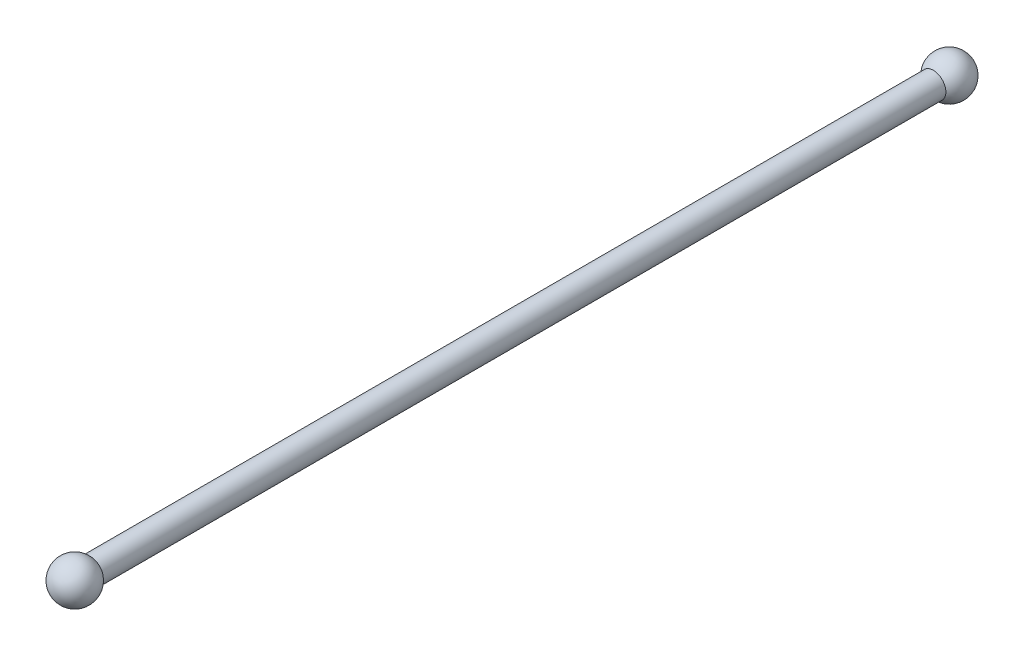
ISO-10303-21;
HEADER;
FILE_DESCRIPTION(('STEP AP214'),'2;1');
FILE_NAME('part.step','',(''),(''),'','','');
FILE_SCHEMA(('AUTOMOTIVE_DESIGN { 1 0 10303 214 1 1 1 1 }'));
ENDSEC;
DATA;
#1=APPLICATION_CONTEXT('core data for automotive mechanical design processes');
#2=APPLICATION_PROTOCOL_DEFINITION('international standard','automotive_design',2000,#1);
#3=PRODUCT_CONTEXT('',#1,'mechanical');
#4=PRODUCT('Part','Part','',(#3));
#5=PRODUCT_RELATED_PRODUCT_CATEGORY('part','',(#4));
#6=PRODUCT_DEFINITION_FORMATION('','',#4);
#7=PRODUCT_DEFINITION_CONTEXT('part definition',#1,'design');
#8=PRODUCT_DEFINITION('design','',#6,#7);
#9=PRODUCT_DEFINITION_SHAPE('','',#8);
#10=(LENGTH_UNIT() NAMED_UNIT(*) SI_UNIT(.MILLI.,.METRE.));
#11=(NAMED_UNIT(*) PLANE_ANGLE_UNIT() SI_UNIT($,.RADIAN.));
#12=(NAMED_UNIT(*) SI_UNIT($,.STERADIAN.) SOLID_ANGLE_UNIT());
#13=UNCERTAINTY_MEASURE_WITH_UNIT(LENGTH_MEASURE(1.E-05),#10,'distance_accuracy_value','');
#14=(GEOMETRIC_REPRESENTATION_CONTEXT(3) GLOBAL_UNCERTAINTY_ASSIGNED_CONTEXT((#13)) GLOBAL_UNIT_ASSIGNED_CONTEXT((#10,
#11,#12)) REPRESENTATION_CONTEXT('',''));
#15=CARTESIAN_POINT('',(0.,0.,0.));
#16=DIRECTION('',(0.,0.,1.));
#17=DIRECTION('',(1.,0.,0.));
#18=AXIS2_PLACEMENT_3D('',#15,#16,#17);
#19=CARTESIAN_POINT('',(0.,0.,116.));
#20=DIRECTION('',(0.,0.,-1.));
#21=DIRECTION('',(-1.,0.,0.));
#22=AXIS2_PLACEMENT_3D('',#19,#20,#21);
#23=CYLINDRICAL_SURFACE('',#22,1.73);
#24=CARTESIAN_POINT('',(0.,0.,116.));
#25=DIRECTION('',(0.,0.,1.));
#26=DIRECTION('',(1.,0.,0.));
#27=AXIS2_PLACEMENT_3D('',#24,#25,#26);
#28=CIRCLE('',#27,1.73);
#29=CARTESIAN_POINT('',(-1.73,0.,116.));
#30=VERTEX_POINT('',#29);
#31=EDGE_CURVE('E10',#30,#30,#28,.T.);
#32=CARTESIAN_POINT('',(0.,0.,0.));
#33=DIRECTION('',(0.,0.,1.));
#34=DIRECTION('',(1.,0.,0.));
#35=AXIS2_PLACEMENT_3D('',#32,#33,#34);
#36=CIRCLE('',#35,1.73);
#37=CARTESIAN_POINT('',(-1.73,0.,0.));
#38=VERTEX_POINT('',#37);
#39=EDGE_CURVE('E38',#38,#38,#36,.T.);
#40=CARTESIAN_POINT('',(-1.73,0.,116.));
#41=CARTESIAN_POINT('',(-1.73,0.,114.791666666667));
#42=CARTESIAN_POINT('',(-1.73,0.,113.583333333333));
#43=CARTESIAN_POINT('',(-1.73,0.,111.166666666667));
#44=CARTESIAN_POINT('',(-1.73,0.,109.958333333333));
#45=CARTESIAN_POINT('',(-1.73,0.,107.541666666667));
#46=CARTESIAN_POINT('',(-1.73,0.,106.333333333333));
#47=CARTESIAN_POINT('',(-1.73,0.,103.916666666667));
#48=CARTESIAN_POINT('',(-1.73,0.,102.708333333333));
#49=CARTESIAN_POINT('',(-1.73,0.,100.291666666667));
#50=CARTESIAN_POINT('',(-1.73,0.,99.0833333333333));
#51=CARTESIAN_POINT('',(-1.73,0.,96.6666666666667));
#52=CARTESIAN_POINT('',(-1.73,0.,95.4583333333333));
#53=CARTESIAN_POINT('',(-1.73,0.,93.0416666666667));
#54=CARTESIAN_POINT('',(-1.73,0.,91.8333333333333));
#55=CARTESIAN_POINT('',(-1.73,0.,89.4166666666667));
#56=CARTESIAN_POINT('',(-1.73,0.,88.2083333333333));
#57=CARTESIAN_POINT('',(-1.73,0.,85.7916666666667));
#58=CARTESIAN_POINT('',(-1.73,0.,84.5833333333333));
#59=CARTESIAN_POINT('',(-1.73,0.,82.1666666666667));
#60=CARTESIAN_POINT('',(-1.73,0.,80.9583333333333));
#61=CARTESIAN_POINT('',(-1.73,0.,78.5416666666667));
#62=CARTESIAN_POINT('',(-1.73,0.,77.3333333333333));
#63=CARTESIAN_POINT('',(-1.73,0.,74.9166666666667));
#64=CARTESIAN_POINT('',(-1.73,0.,73.7083333333333));
#65=CARTESIAN_POINT('',(-1.73,0.,71.2916666666667));
#66=CARTESIAN_POINT('',(-1.73,0.,70.0833333333333));
#67=CARTESIAN_POINT('',(-1.73,0.,67.6666666666667));
#68=CARTESIAN_POINT('',(-1.73,0.,66.4583333333333));
#69=CARTESIAN_POINT('',(-1.73,0.,64.0416666666667));
#70=CARTESIAN_POINT('',(-1.73,0.,62.8333333333333));
#71=CARTESIAN_POINT('',(-1.73,0.,60.4166666666667));
#72=CARTESIAN_POINT('',(-1.73,0.,59.2083333333333));
#73=CARTESIAN_POINT('',(-1.73,0.,56.7916666666667));
#74=CARTESIAN_POINT('',(-1.73,0.,55.5833333333333));
#75=CARTESIAN_POINT('',(-1.73,0.,53.1666666666667));
#76=CARTESIAN_POINT('',(-1.73,0.,51.9583333333333));
#77=CARTESIAN_POINT('',(-1.73,0.,49.5416666666667));
#78=CARTESIAN_POINT('',(-1.73,0.,48.3333333333333));
#79=CARTESIAN_POINT('',(-1.73,0.,45.9166666666667));
#80=CARTESIAN_POINT('',(-1.73,0.,44.7083333333333));
#81=CARTESIAN_POINT('',(-1.73,0.,42.2916666666667));
#82=CARTESIAN_POINT('',(-1.73,0.,41.0833333333333));
#83=CARTESIAN_POINT('',(-1.73,0.,38.6666666666667));
#84=CARTESIAN_POINT('',(-1.73,0.,37.4583333333333));
#85=CARTESIAN_POINT('',(-1.73,0.,35.0416666666667));
#86=CARTESIAN_POINT('',(-1.73,0.,33.8333333333333));
#87=CARTESIAN_POINT('',(-1.73,0.,31.4166666666667));
#88=CARTESIAN_POINT('',(-1.73,0.,30.2083333333333));
#89=CARTESIAN_POINT('',(-1.73,0.,27.7916666666667));
#90=CARTESIAN_POINT('',(-1.73,0.,26.5833333333333));
#91=CARTESIAN_POINT('',(-1.73,0.,24.1666666666667));
#92=CARTESIAN_POINT('',(-1.73,0.,22.9583333333333));
#93=CARTESIAN_POINT('',(-1.73,0.,20.5416666666667));
#94=CARTESIAN_POINT('',(-1.73,0.,19.3333333333333));
#95=CARTESIAN_POINT('',(-1.73,0.,16.9166666666667));
#96=CARTESIAN_POINT('',(-1.73,0.,15.7083333333333));
#97=CARTESIAN_POINT('',(-1.73,0.,13.2916666666667));
#98=CARTESIAN_POINT('',(-1.73,0.,12.0833333333333));
#99=CARTESIAN_POINT('',(-1.73,0.,9.66666666666667));
#100=CARTESIAN_POINT('',(-1.73,0.,8.45833333333334));
#101=CARTESIAN_POINT('',(-1.73,0.,6.04166666666667));
#102=CARTESIAN_POINT('',(-1.73,0.,4.83333333333334));
#103=CARTESIAN_POINT('',(-1.73,0.,2.41666666666667));
#104=CARTESIAN_POINT('',(-1.73,0.,1.20833333333333));
#105=CARTESIAN_POINT('',(-1.73,0.,0.));
#106=B_SPLINE_CURVE_WITH_KNOTS('',3,(#40,#41,#42,#43,#44,#45,#46,#47,#48,#49,#50,#51,#52,#53,
#54,#55,#56,#57,#58,#59,#60,#61,#62,#63,#64,#65,#66,#67,#68,#69,#70,#71,#72,#73,#74,#75,#76,#77,
#78,#79,#80,#81,#82,#83,#84,#85,#86,#87,#88,#89,#90,#91,#92,#93,#94,#95,#96,#97,#98,#99,#100,
#101,#102,#103,#104,#105),.UNSPECIFIED.,.F.,.F.,(4,2,2,2,2,2,2,2,2,2,2,2,2,2,2,2,2,2,2,2,2,2,2,
2,2,2,2,2,2,2,2,2,4),(0.,3.625,7.25000000000001,10.875,14.5,18.125,21.75,25.375,29.,32.625,
36.25,39.875,43.5,47.125,50.75,54.375,58.,61.625,65.25,68.875,72.5,76.125,79.75,83.375,87.,
90.625,94.25,97.875,101.5,105.125,108.75,112.375,116.),.UNSPECIFIED.);
#107=EDGE_CURVE('BSEAM31',#30,#38,#106,.T.);
#108=ORIENTED_EDGE('',*,*,#31,.F.);
#109=ORIENTED_EDGE('',*,*,#39,.T.);
#110=ORIENTED_EDGE('',*,*,#107,.T.);
#111=ORIENTED_EDGE('',*,*,#107,.F.);
#112=EDGE_LOOP('',(#108,#110,#109,#111));
#113=FACE_BOUND('',#112,.T.);
#114=ADVANCED_FACE('F31',(#113),#23,.T.);
#115=CARTESIAN_POINT('',(0.,0.,118.20071));
#116=DIRECTION('',(0.,0.,1.));
#117=DIRECTION('',(1.,0.,0.));
#118=AXIS2_PLACEMENT_3D('',#115,#116,#117);
#119=SPHERICAL_SURFACE('',#118,2.79929);
#120=ORIENTED_EDGE('',*,*,#31,.T.);
#121=EDGE_LOOP('',(#120));
#122=FACE_BOUND('',#121,.T.);
#123=ADVANCED_FACE('F33',(#122),#119,.T.);
#124=CARTESIAN_POINT('',(0.,0.,-2.20071));
#125=DIRECTION('',(0.,0.,1.));
#126=DIRECTION('',(1.,0.,0.));
#127=AXIS2_PLACEMENT_3D('',#124,#125,#126);
#128=SPHERICAL_SURFACE('',#127,2.79929);
#129=ORIENTED_EDGE('',*,*,#39,.F.);
#130=EDGE_LOOP('',(#129));
#131=FACE_BOUND('',#130,.T.);
#132=ADVANCED_FACE('F45',(#131),#128,.T.);
#133=CLOSED_SHELL('',(#114,#123,#132));
#134=MANIFOLD_SOLID_BREP('B2',#133);
#135=ADVANCED_BREP_SHAPE_REPRESENTATION('',(#18,#134),#14);
#136=SHAPE_DEFINITION_REPRESENTATION(#9,#135);
ENDSEC;
END-ISO-10303-21;
